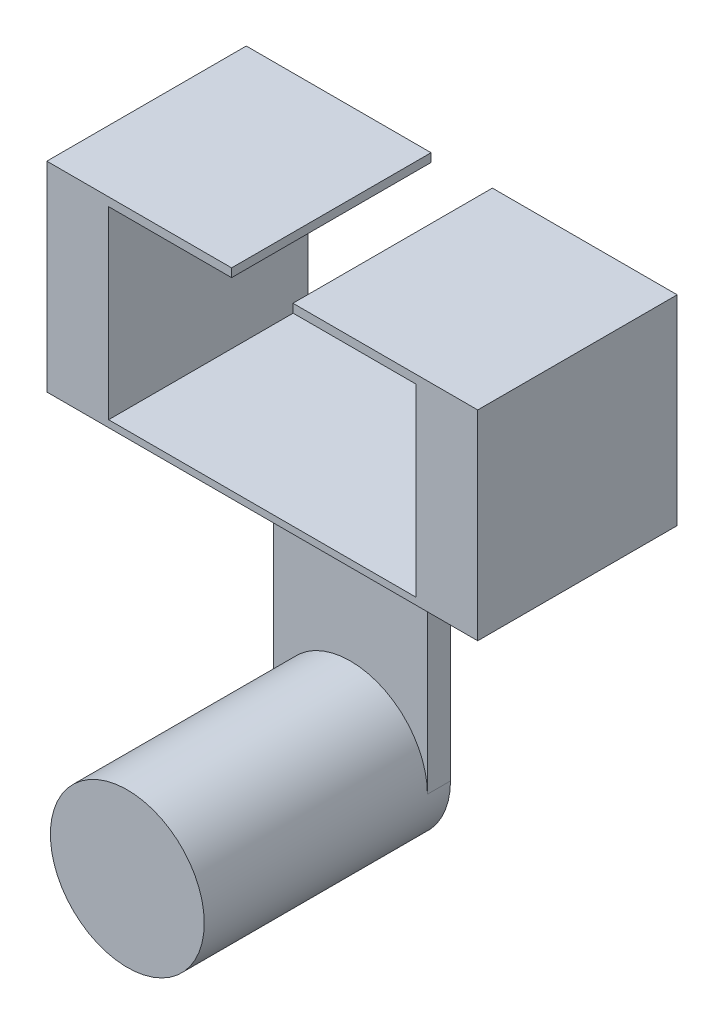
ISO-10303-21;
HEADER;
FILE_DESCRIPTION(('STEP AP214'),'2;1');
FILE_NAME('part.step','',(''),(''),'','','');
FILE_SCHEMA(('AUTOMOTIVE_DESIGN { 1 0 10303 214 1 1 1 1 }'));
ENDSEC;
DATA;
#1=APPLICATION_CONTEXT('core data for automotive mechanical design processes');
#2=APPLICATION_PROTOCOL_DEFINITION('international standard','automotive_design',2000,#1);
#3=PRODUCT_CONTEXT('',#1,'mechanical');
#4=PRODUCT('Part','Part','',(#3));
#5=PRODUCT_RELATED_PRODUCT_CATEGORY('part','',(#4));
#6=PRODUCT_DEFINITION_FORMATION('','',#4);
#7=PRODUCT_DEFINITION_CONTEXT('part definition',#1,'design');
#8=PRODUCT_DEFINITION('design','',#6,#7);
#9=PRODUCT_DEFINITION_SHAPE('','',#8);
#10=(LENGTH_UNIT() NAMED_UNIT(*) SI_UNIT(.MILLI.,.METRE.));
#11=(NAMED_UNIT(*) PLANE_ANGLE_UNIT() SI_UNIT($,.RADIAN.));
#12=(NAMED_UNIT(*) SI_UNIT($,.STERADIAN.) SOLID_ANGLE_UNIT());
#13=UNCERTAINTY_MEASURE_WITH_UNIT(LENGTH_MEASURE(1.E-05),#10,'distance_accuracy_value','');
#14=(GEOMETRIC_REPRESENTATION_CONTEXT(3) GLOBAL_UNCERTAINTY_ASSIGNED_CONTEXT((#13)) GLOBAL_UNIT_ASSIGNED_CONTEXT((#10,
#11,#12)) REPRESENTATION_CONTEXT('',''));
#15=CARTESIAN_POINT('',(0.,0.,0.));
#16=DIRECTION('',(0.,0.,1.));
#17=DIRECTION('',(1.,0.,0.));
#18=AXIS2_PLACEMENT_3D('',#15,#16,#17);
#19=CARTESIAN_POINT('',(0.,92.0496,0.));
#20=DIRECTION('',(0.,-1.,0.));
#21=DIRECTION('',(0.,0.,-1.));
#22=AXIS2_PLACEMENT_3D('',#19,#20,#21);
#23=PLANE('',#22);
#24=DIRECTION('',(-1.,0.,0.));
#25=VECTOR('',#24,1.);
#26=CARTESIAN_POINT('',(-44.45,92.0496,-18.19275));
#27=LINE('',#26,#25);
#28=CARTESIAN_POINT('',(44.45,92.0496,-18.19275));
#29=VERTEX_POINT('',#28);
#30=CARTESIAN_POINT('',(6.3246,92.0496,-18.19275));
#31=VERTEX_POINT('',#30);
#32=EDGE_CURVE('E266',#29,#31,#27,.T.);
#33=ORIENTED_EDGE('',*,*,#32,.T.);
#34=DIRECTION('',(0.,0.,1.));
#35=VECTOR('',#34,1.);
#36=CARTESIAN_POINT('',(6.3246,92.0496,-18.19275));
#37=LINE('',#36,#35);
#38=CARTESIAN_POINT('',(6.3246,92.0496,22.95525));
#39=VERTEX_POINT('',#38);
#40=EDGE_CURVE('E240',#31,#39,#37,.T.);
#41=ORIENTED_EDGE('',*,*,#40,.T.);
#42=DIRECTION('',(1.,0.,0.));
#43=VECTOR('',#42,1.);
#44=CARTESIAN_POINT('',(-44.45,92.0496,22.95525));
#45=LINE('',#44,#43);
#46=CARTESIAN_POINT('',(44.45,92.0496,22.95525));
#47=VERTEX_POINT('',#46);
#48=EDGE_CURVE('E273',#39,#47,#45,.T.);
#49=ORIENTED_EDGE('',*,*,#48,.T.);
#50=DIRECTION('',(0.,0.,-1.));
#51=VECTOR('',#50,1.);
#52=CARTESIAN_POINT('',(44.45,92.0496,22.95525));
#53=LINE('',#52,#51);
#54=EDGE_CURVE('E261',#47,#29,#53,.T.);
#55=ORIENTED_EDGE('',*,*,#54,.T.);
#56=EDGE_LOOP('',(#33,#41,#49,#55));
#57=FACE_BOUND('',#56,.T.);
#58=ADVANCED_FACE('F58',(#57),#23,.F.);
#59=CARTESIAN_POINT('',(0.,0.,50.8));
#60=DIRECTION('',(0.,0.,-1.));
#61=DIRECTION('',(-1.,0.,0.));
#62=AXIS2_PLACEMENT_3D('',#59,#60,#61);
#63=CYLINDRICAL_SURFACE('',#62,15.875);
#64=CARTESIAN_POINT('',(0.,0.,50.8));
#65=DIRECTION('',(0.,0.,1.));
#66=DIRECTION('',(1.,0.,0.));
#67=AXIS2_PLACEMENT_3D('',#64,#65,#66);
#68=CIRCLE('',#67,15.875);
#69=CARTESIAN_POINT('',(15.875,0.,50.8));
#70=VERTEX_POINT('',#69);
#71=EDGE_CURVE('E67',#70,#70,#68,.T.);
#72=ORIENTED_EDGE('',*,*,#71,.F.);
#73=EDGE_LOOP('',(#72));
#74=FACE_BOUND('',#73,.T.);
#75=CARTESIAN_POINT('',(0.,0.,4.7625));
#76=DIRECTION('',(0.,0.,1.));
#77=DIRECTION('',(1.,0.,0.));
#78=AXIS2_PLACEMENT_3D('',#75,#76,#77);
#79=CIRCLE('',#78,15.875);
#80=CARTESIAN_POINT('',(15.875,0.,4.7625));
#81=VERTEX_POINT('',#80);
#82=CARTESIAN_POINT('',(-15.875,0.,4.7625));
#83=VERTEX_POINT('',#82);
#84=EDGE_CURVE('E13',#81,#83,#79,.T.);
#85=ORIENTED_EDGE('',*,*,#84,.T.);
#86=DIRECTION('',(0.,0.,-1.));
#87=VECTOR('',#86,1.);
#88=CARTESIAN_POINT('',(-15.875,0.,4.7625));
#89=LINE('',#88,#87);
#90=CARTESIAN_POINT('',(-15.875,0.,0.));
#91=VERTEX_POINT('',#90);
#92=EDGE_CURVE('E336',#83,#91,#89,.T.);
#93=ORIENTED_EDGE('',*,*,#92,.T.);
#94=CARTESIAN_POINT('',(0.,0.,0.));
#95=DIRECTION('',(0.,0.,1.));
#96=DIRECTION('',(1.,0.,0.));
#97=AXIS2_PLACEMENT_3D('',#94,#95,#96);
#98=CIRCLE('',#97,15.875);
#99=CARTESIAN_POINT('',(15.875,0.,0.));
#100=VERTEX_POINT('',#99);
#101=EDGE_CURVE('E332',#91,#100,#98,.T.);
#102=ORIENTED_EDGE('',*,*,#101,.T.);
#103=DIRECTION('',(0.,0.,-1.));
#104=VECTOR('',#103,1.);
#105=CARTESIAN_POINT('',(15.875,0.,4.7625));
#106=LINE('',#105,#104);
#107=EDGE_CURVE('E318',#81,#100,#106,.T.);
#108=ORIENTED_EDGE('',*,*,#107,.F.);
#109=EDGE_LOOP('',(#85,#93,#102,#108));
#110=FACE_BOUND('',#109,.T.);
#111=ADVANCED_FACE('F60',(#74,#110),#63,.T.);
#112=CARTESIAN_POINT('',(0.,0.,50.8));
#113=DIRECTION('',(0.,0.,1.));
#114=DIRECTION('',(1.,0.,0.));
#115=AXIS2_PLACEMENT_3D('',#112,#113,#114);
#116=PLANE('',#115);
#117=ORIENTED_EDGE('',*,*,#71,.T.);
#118=EDGE_LOOP('',(#117));
#119=FACE_BOUND('',#118,.T.);
#120=ADVANCED_FACE('F380',(#119),#116,.T.);
#121=CARTESIAN_POINT('',(0.,0.,0.));
#122=DIRECTION('',(0.,0.,1.));
#123=DIRECTION('',(1.,0.,0.));
#124=AXIS2_PLACEMENT_3D('',#121,#122,#123);
#125=PLANE('',#124);
#126=ORIENTED_EDGE('',*,*,#101,.F.);
#127=DIRECTION('',(0.,1.,0.));
#128=VECTOR('',#127,1.);
#129=CARTESIAN_POINT('',(-15.875,0.,0.));
#130=LINE('',#129,#128);
#131=CARTESIAN_POINT('',(-15.875,50.8,0.));
#132=VERTEX_POINT('',#131);
#133=EDGE_CURVE('E322',#91,#132,#130,.T.);
#134=ORIENTED_EDGE('',*,*,#133,.T.);
#135=DIRECTION('',(1.,0.,0.));
#136=VECTOR('',#135,1.);
#137=CARTESIAN_POINT('',(15.875,50.8,0.));
#138=LINE('',#137,#136);
#139=CARTESIAN_POINT('',(15.875,50.8,0.));
#140=VERTEX_POINT('',#139);
#141=EDGE_CURVE('E311',#132,#140,#138,.T.);
#142=ORIENTED_EDGE('',*,*,#141,.T.);
#143=DIRECTION('',(0.,-1.,0.));
#144=VECTOR('',#143,1.);
#145=CARTESIAN_POINT('',(15.875,0.,0.));
#146=LINE('',#145,#144);
#147=EDGE_CURVE('E305',#140,#100,#146,.T.);
#148=ORIENTED_EDGE('',*,*,#147,.T.);
#149=EDGE_LOOP('',(#126,#134,#142,#148));
#150=FACE_BOUND('',#149,.T.);
#151=ADVANCED_FACE('F352',(#150),#125,.F.);
#152=CARTESIAN_POINT('',(15.875,0.,4.7625));
#153=DIRECTION('',(1.,0.,0.));
#154=DIRECTION('',(0.,0.,-1.));
#155=AXIS2_PLACEMENT_3D('',#152,#153,#154);
#156=PLANE('',#155);
#157=ORIENTED_EDGE('',*,*,#147,.F.);
#158=DIRECTION('',(0.,0.,-1.));
#159=VECTOR('',#158,1.);
#160=CARTESIAN_POINT('',(15.875,50.8,4.7625));
#161=LINE('',#160,#159);
#162=CARTESIAN_POINT('',(15.875,50.8,4.7625));
#163=VERTEX_POINT('',#162);
#164=EDGE_CURVE('E328',#163,#140,#161,.T.);
#165=ORIENTED_EDGE('',*,*,#164,.F.);
#166=DIRECTION('',(0.,-1.,0.));
#167=VECTOR('',#166,1.);
#168=CARTESIAN_POINT('',(15.875,0.,4.7625));
#169=LINE('',#168,#167);
#170=EDGE_CURVE('E306',#163,#81,#169,.T.);
#171=ORIENTED_EDGE('',*,*,#170,.T.);
#172=ORIENTED_EDGE('',*,*,#107,.T.);
#173=EDGE_LOOP('',(#157,#165,#171,#172));
#174=FACE_BOUND('',#173,.T.);
#175=ADVANCED_FACE('F350',(#174),#156,.T.);
#176=CARTESIAN_POINT('',(-15.875,0.,4.7625));
#177=DIRECTION('',(-1.,0.,0.));
#178=DIRECTION('',(0.,0.,1.));
#179=AXIS2_PLACEMENT_3D('',#176,#177,#178);
#180=PLANE('',#179);
#181=ORIENTED_EDGE('',*,*,#133,.F.);
#182=ORIENTED_EDGE('',*,*,#92,.F.);
#183=DIRECTION('',(0.,1.,0.));
#184=VECTOR('',#183,1.);
#185=CARTESIAN_POINT('',(-15.875,0.,4.7625));
#186=LINE('',#185,#184);
#187=CARTESIAN_POINT('',(-15.875,50.8,4.7625));
#188=VERTEX_POINT('',#187);
#189=EDGE_CURVE('E310',#83,#188,#186,.T.);
#190=ORIENTED_EDGE('',*,*,#189,.T.);
#191=DIRECTION('',(0.,0.,-1.));
#192=VECTOR('',#191,1.);
#193=CARTESIAN_POINT('',(-15.875,50.8,4.7625));
#194=LINE('',#193,#192);
#195=EDGE_CURVE('E333',#188,#132,#194,.T.);
#196=ORIENTED_EDGE('',*,*,#195,.T.);
#197=EDGE_LOOP('',(#181,#182,#190,#196));
#198=FACE_BOUND('',#197,.T.);
#199=ADVANCED_FACE('F362',(#198),#180,.T.);
#200=CARTESIAN_POINT('',(0.,0.,4.7625));
#201=DIRECTION('',(0.,0.,1.));
#202=DIRECTION('',(1.,0.,0.));
#203=AXIS2_PLACEMENT_3D('',#200,#201,#202);
#204=PLANE('',#203);
#205=ORIENTED_EDGE('',*,*,#84,.F.);
#206=ORIENTED_EDGE('',*,*,#170,.F.);
#207=DIRECTION('',(1.,0.,0.));
#208=VECTOR('',#207,1.);
#209=CARTESIAN_POINT('',(15.875,50.8,4.7625));
#210=LINE('',#209,#208);
#211=EDGE_CURVE('E314',#188,#163,#210,.T.);
#212=ORIENTED_EDGE('',*,*,#211,.F.);
#213=ORIENTED_EDGE('',*,*,#189,.F.);
#214=EDGE_LOOP('',(#205,#206,#212,#213));
#215=FACE_BOUND('',#214,.T.);
#216=ADVANCED_FACE('F359',(#215),#204,.T.);
#217=CARTESIAN_POINT('',(0.,50.8,0.));
#218=DIRECTION('',(0.,-1.,0.));
#219=DIRECTION('',(0.,0.,-1.));
#220=AXIS2_PLACEMENT_3D('',#217,#218,#219);
#221=PLANE('',#220);
#222=DIRECTION('',(0.,0.,-1.));
#223=VECTOR('',#222,1.);
#224=CARTESIAN_POINT('',(44.45,50.8,22.95525));
#225=LINE('',#224,#223);
#226=CARTESIAN_POINT('',(44.45,50.8,22.95525));
#227=VERTEX_POINT('',#226);
#228=CARTESIAN_POINT('',(44.45,50.8,-18.19275));
#229=VERTEX_POINT('',#228);
#230=EDGE_CURVE('E244',#227,#229,#225,.T.);
#231=ORIENTED_EDGE('',*,*,#230,.F.);
#232=DIRECTION('',(1.,0.,0.));
#233=VECTOR('',#232,1.);
#234=CARTESIAN_POINT('',(-44.45,50.8,22.95525));
#235=LINE('',#234,#233);
#236=CARTESIAN_POINT('',(-44.45,50.8,22.95525));
#237=VERTEX_POINT('',#236);
#238=EDGE_CURVE('E265',#237,#227,#235,.T.);
#239=ORIENTED_EDGE('',*,*,#238,.F.);
#240=DIRECTION('',(0.,0.,1.));
#241=VECTOR('',#240,1.);
#242=CARTESIAN_POINT('',(-44.45,50.8,22.95525));
#243=LINE('',#242,#241);
#244=CARTESIAN_POINT('',(-44.45,50.8,-18.19275));
#245=VERTEX_POINT('',#244);
#246=EDGE_CURVE('E285',#245,#237,#243,.T.);
#247=ORIENTED_EDGE('',*,*,#246,.F.);
#248=DIRECTION('',(-1.,0.,0.));
#249=VECTOR('',#248,1.);
#250=CARTESIAN_POINT('',(-44.45,50.8,-18.19275));
#251=LINE('',#250,#249);
#252=EDGE_CURVE('E282',#229,#245,#251,.T.);
#253=ORIENTED_EDGE('',*,*,#252,.F.);
#254=EDGE_LOOP('',(#231,#239,#247,#253));
#255=FACE_BOUND('',#254,.T.);
#256=ORIENTED_EDGE('',*,*,#141,.F.);
#257=ORIENTED_EDGE('',*,*,#195,.F.);
#258=ORIENTED_EDGE('',*,*,#211,.T.);
#259=ORIENTED_EDGE('',*,*,#164,.T.);
#260=EDGE_LOOP('',(#256,#257,#258,#259));
#261=FACE_BOUND('',#260,.T.);
#262=ADVANCED_FACE('F356',(#255,#261),#221,.T.);
#263=CARTESIAN_POINT('',(44.45,92.0496,22.95525));
#264=DIRECTION('',(-1.,0.,0.));
#265=DIRECTION('',(0.,0.,1.));
#266=AXIS2_PLACEMENT_3D('',#263,#264,#265);
#267=PLANE('',#266);
#268=ORIENTED_EDGE('',*,*,#230,.T.);
#269=DIRECTION('',(0.,-1.,0.));
#270=VECTOR('',#269,1.);
#271=CARTESIAN_POINT('',(44.45,92.0496,-18.19275));
#272=LINE('',#271,#270);
#273=EDGE_CURVE('E301',#29,#229,#272,.T.);
#274=ORIENTED_EDGE('',*,*,#273,.F.);
#275=ORIENTED_EDGE('',*,*,#54,.F.);
#276=DIRECTION('',(0.,-1.,0.));
#277=VECTOR('',#276,1.);
#278=CARTESIAN_POINT('',(44.45,92.0496,22.95525));
#279=LINE('',#278,#277);
#280=EDGE_CURVE('E278',#47,#227,#279,.T.);
#281=ORIENTED_EDGE('',*,*,#280,.T.);
#282=EDGE_LOOP('',(#268,#274,#275,#281));
#283=FACE_BOUND('',#282,.T.);
#284=ADVANCED_FACE('F422',(#283),#267,.F.);
#285=CARTESIAN_POINT('',(-44.45,92.0496,-18.19275));
#286=DIRECTION('',(0.,0.,1.));
#287=DIRECTION('',(1.,0.,0.));
#288=AXIS2_PLACEMENT_3D('',#285,#286,#287);
#289=PLANE('',#288);
#290=DIRECTION('',(-1.,0.,0.));
#291=VECTOR('',#290,1.);
#292=CARTESIAN_POINT('',(31.70428,90.297,-18.19275));
#293=LINE('',#292,#291);
#294=CARTESIAN_POINT('',(31.70428,90.297,-18.19275));
#295=VERTEX_POINT('',#294);
#296=CARTESIAN_POINT('',(6.3246,90.297,-18.19275));
#297=VERTEX_POINT('',#296);
#298=EDGE_CURVE('E213',#295,#297,#293,.T.);
#299=ORIENTED_EDGE('',*,*,#298,.T.);
#300=DIRECTION('',(0.,1.,0.));
#301=VECTOR('',#300,1.);
#302=CARTESIAN_POINT('',(6.3246,90.297,-18.19275));
#303=LINE('',#302,#301);
#304=EDGE_CURVE('E216',#297,#31,#303,.T.);
#305=ORIENTED_EDGE('',*,*,#304,.T.);
#306=ORIENTED_EDGE('',*,*,#32,.F.);
#307=ORIENTED_EDGE('',*,*,#273,.T.);
#308=ORIENTED_EDGE('',*,*,#252,.T.);
#309=DIRECTION('',(0.,-1.,0.));
#310=VECTOR('',#309,1.);
#311=CARTESIAN_POINT('',(-44.45,92.0496,-18.19275));
#312=LINE('',#311,#310);
#313=CARTESIAN_POINT('',(-44.45,92.0496,-18.19275));
#314=VERTEX_POINT('',#313);
#315=EDGE_CURVE('E297',#314,#245,#312,.T.);
#316=ORIENTED_EDGE('',*,*,#315,.F.);
#317=CARTESIAN_POINT('',(-6.3246,92.0496,-18.19275));
#318=VERTEX_POINT('',#317);
#319=EDGE_CURVE('E194',#318,#314,#27,.T.);
#320=ORIENTED_EDGE('',*,*,#319,.F.);
#321=DIRECTION('',(0.,-1.,0.));
#322=VECTOR('',#321,1.);
#323=CARTESIAN_POINT('',(-6.3246,92.0496,-18.19275));
#324=LINE('',#323,#322);
#325=CARTESIAN_POINT('',(-6.3246,90.297,-18.19275));
#326=VERTEX_POINT('',#325);
#327=EDGE_CURVE('E74',#318,#326,#324,.T.);
#328=ORIENTED_EDGE('',*,*,#327,.T.);
#329=DIRECTION('',(-1.,0.,0.));
#330=VECTOR('',#329,1.);
#331=CARTESIAN_POINT('',(-6.3246,90.297,-18.19275));
#332=LINE('',#331,#330);
#333=CARTESIAN_POINT('',(-31.70428,90.297,-18.19275));
#334=VERTEX_POINT('',#333);
#335=EDGE_CURVE('E182',#326,#334,#332,.T.);
#336=ORIENTED_EDGE('',*,*,#335,.T.);
#337=DIRECTION('',(0.,-1.,0.));
#338=VECTOR('',#337,1.);
#339=CARTESIAN_POINT('',(-31.70428,90.297,-18.19275));
#340=LINE('',#339,#338);
#341=CARTESIAN_POINT('',(-31.70428,52.2224,-18.19275));
#342=VERTEX_POINT('',#341);
#343=EDGE_CURVE('E188',#334,#342,#340,.T.);
#344=ORIENTED_EDGE('',*,*,#343,.T.);
#345=DIRECTION('',(1.,0.,0.));
#346=VECTOR('',#345,1.);
#347=CARTESIAN_POINT('',(-31.70428,52.2224,-18.19275));
#348=LINE('',#347,#346);
#349=CARTESIAN_POINT('',(31.70428,52.2224,-18.19275));
#350=VERTEX_POINT('',#349);
#351=EDGE_CURVE('E205',#342,#350,#348,.T.);
#352=ORIENTED_EDGE('',*,*,#351,.T.);
#353=DIRECTION('',(0.,1.,0.));
#354=VECTOR('',#353,1.);
#355=CARTESIAN_POINT('',(31.70428,52.2224,-18.19275));
#356=LINE('',#355,#354);
#357=EDGE_CURVE('E209',#350,#295,#356,.T.);
#358=ORIENTED_EDGE('',*,*,#357,.T.);
#359=EDGE_LOOP('',(#299,#305,#306,#307,#308,#316,#320,#328,#336,#344,#352,#358));
#360=FACE_BOUND('',#359,.T.);
#361=ADVANCED_FACE('F192',(#360),#289,.F.);
#362=CARTESIAN_POINT('',(-44.45,92.0496,22.95525));
#363=DIRECTION('',(1.,0.,0.));
#364=DIRECTION('',(0.,0.,-1.));
#365=AXIS2_PLACEMENT_3D('',#362,#363,#364);
#366=PLANE('',#365);
#367=ORIENTED_EDGE('',*,*,#246,.T.);
#368=DIRECTION('',(0.,-1.,0.));
#369=VECTOR('',#368,1.);
#370=CARTESIAN_POINT('',(-44.45,92.0496,22.95525));
#371=LINE('',#370,#369);
#372=CARTESIAN_POINT('',(-44.45,92.0496,22.95525));
#373=VERTEX_POINT('',#372);
#374=EDGE_CURVE('E293',#373,#237,#371,.T.);
#375=ORIENTED_EDGE('',*,*,#374,.F.);
#376=DIRECTION('',(0.,0.,1.));
#377=VECTOR('',#376,1.);
#378=CARTESIAN_POINT('',(-44.45,92.0496,22.95525));
#379=LINE('',#378,#377);
#380=EDGE_CURVE('E270',#314,#373,#379,.T.);
#381=ORIENTED_EDGE('',*,*,#380,.F.);
#382=ORIENTED_EDGE('',*,*,#315,.T.);
#383=EDGE_LOOP('',(#367,#375,#381,#382));
#384=FACE_BOUND('',#383,.T.);
#385=ADVANCED_FACE('F395',(#384),#366,.F.);
#386=CARTESIAN_POINT('',(-44.45,92.0496,22.95525));
#387=DIRECTION('',(0.,0.,-1.));
#388=DIRECTION('',(-1.,0.,0.));
#389=AXIS2_PLACEMENT_3D('',#386,#387,#388);
#390=PLANE('',#389);
#391=ORIENTED_EDGE('',*,*,#48,.F.);
#392=DIRECTION('',(0.,1.,0.));
#393=VECTOR('',#392,1.);
#394=CARTESIAN_POINT('',(6.3246,90.297,22.95525));
#395=LINE('',#394,#393);
#396=CARTESIAN_POINT('',(6.3246,90.297,22.95525));
#397=VERTEX_POINT('',#396);
#398=EDGE_CURVE('E196',#397,#39,#395,.T.);
#399=ORIENTED_EDGE('',*,*,#398,.F.);
#400=DIRECTION('',(-1.,0.,0.));
#401=VECTOR('',#400,1.);
#402=CARTESIAN_POINT('',(31.70428,90.297,22.95525));
#403=LINE('',#402,#401);
#404=CARTESIAN_POINT('',(31.70428,90.297,22.95525));
#405=VERTEX_POINT('',#404);
#406=EDGE_CURVE('E200',#405,#397,#403,.T.);
#407=ORIENTED_EDGE('',*,*,#406,.F.);
#408=DIRECTION('',(0.,1.,0.));
#409=VECTOR('',#408,1.);
#410=CARTESIAN_POINT('',(31.70428,52.2224,22.95525));
#411=LINE('',#410,#409);
#412=CARTESIAN_POINT('',(31.70428,52.2224,22.95525));
#413=VERTEX_POINT('',#412);
#414=EDGE_CURVE('E233',#413,#405,#411,.T.);
#415=ORIENTED_EDGE('',*,*,#414,.F.);
#416=DIRECTION('',(1.,0.,0.));
#417=VECTOR('',#416,1.);
#418=CARTESIAN_POINT('',(-31.70428,52.2224,22.95525));
#419=LINE('',#418,#417);
#420=CARTESIAN_POINT('',(-31.70428,52.2224,22.95525));
#421=VERTEX_POINT('',#420);
#422=EDGE_CURVE('E229',#421,#413,#419,.T.);
#423=ORIENTED_EDGE('',*,*,#422,.F.);
#424=DIRECTION('',(0.,-1.,0.));
#425=VECTOR('',#424,1.);
#426=CARTESIAN_POINT('',(-31.70428,90.297,22.95525));
#427=LINE('',#426,#425);
#428=CARTESIAN_POINT('',(-31.70428,90.297,22.95525));
#429=VERTEX_POINT('',#428);
#430=EDGE_CURVE('E225',#429,#421,#427,.T.);
#431=ORIENTED_EDGE('',*,*,#430,.F.);
#432=DIRECTION('',(-1.,0.,0.));
#433=VECTOR('',#432,1.);
#434=CARTESIAN_POINT('',(-6.3246,90.297,22.95525));
#435=LINE('',#434,#433);
#436=CARTESIAN_POINT('',(-6.3246,90.297,22.95525));
#437=VERTEX_POINT('',#436);
#438=EDGE_CURVE('E222',#437,#429,#435,.T.);
#439=ORIENTED_EDGE('',*,*,#438,.F.);
#440=DIRECTION('',(0.,-1.,0.));
#441=VECTOR('',#440,1.);
#442=CARTESIAN_POINT('',(-6.3246,92.0496,22.95525));
#443=LINE('',#442,#441);
#444=CARTESIAN_POINT('',(-6.3246,92.0496,22.95525));
#445=VERTEX_POINT('',#444);
#446=EDGE_CURVE('E173',#445,#437,#443,.T.);
#447=ORIENTED_EDGE('',*,*,#446,.F.);
#448=EDGE_CURVE('E274',#373,#445,#45,.T.);
#449=ORIENTED_EDGE('',*,*,#448,.F.);
#450=ORIENTED_EDGE('',*,*,#374,.T.);
#451=ORIENTED_EDGE('',*,*,#238,.T.);
#452=ORIENTED_EDGE('',*,*,#280,.F.);
#453=EDGE_LOOP('',(#391,#399,#407,#415,#423,#431,#439,#447,#449,#450,#451,#452));
#454=FACE_BOUND('',#453,.T.);
#455=ADVANCED_FACE('F386',(#454),#390,.F.);
#456=ORIENTED_EDGE('',*,*,#448,.T.);
#457=DIRECTION('',(0.,0.,1.));
#458=VECTOR('',#457,1.);
#459=CARTESIAN_POINT('',(-6.3246,92.0496,-18.19275));
#460=LINE('',#459,#458);
#461=EDGE_CURVE('E179',#318,#445,#460,.T.);
#462=ORIENTED_EDGE('',*,*,#461,.F.);
#463=ORIENTED_EDGE('',*,*,#319,.T.);
#464=ORIENTED_EDGE('',*,*,#380,.T.);
#465=EDGE_LOOP('',(#456,#462,#463,#464));
#466=FACE_BOUND('',#465,.T.);
#467=ADVANCED_FACE('F374',(#466),#23,.F.);
#468=CARTESIAN_POINT('',(6.3246,90.297,-18.19275));
#469=DIRECTION('',(1.,0.,0.));
#470=DIRECTION('',(0.,1.,0.));
#471=AXIS2_PLACEMENT_3D('',#468,#469,#470);
#472=PLANE('',#471);
#473=ORIENTED_EDGE('',*,*,#398,.T.);
#474=ORIENTED_EDGE('',*,*,#40,.F.);
#475=ORIENTED_EDGE('',*,*,#304,.F.);
#476=DIRECTION('',(0.,0.,1.));
#477=VECTOR('',#476,1.);
#478=CARTESIAN_POINT('',(6.3246,90.297,-18.19275));
#479=LINE('',#478,#477);
#480=EDGE_CURVE('E245',#297,#397,#479,.T.);
#481=ORIENTED_EDGE('',*,*,#480,.T.);
#482=EDGE_LOOP('',(#473,#474,#475,#481));
#483=FACE_BOUND('',#482,.T.);
#484=ADVANCED_FACE('F385',(#483),#472,.F.);
#485=CARTESIAN_POINT('',(31.70428,90.297,-18.19275));
#486=DIRECTION('',(0.,1.,0.));
#487=DIRECTION('',(-1.,0.,0.));
#488=AXIS2_PLACEMENT_3D('',#485,#486,#487);
#489=PLANE('',#488);
#490=ORIENTED_EDGE('',*,*,#406,.T.);
#491=ORIENTED_EDGE('',*,*,#480,.F.);
#492=ORIENTED_EDGE('',*,*,#298,.F.);
#493=DIRECTION('',(0.,0.,1.));
#494=VECTOR('',#493,1.);
#495=CARTESIAN_POINT('',(31.70428,90.297,-18.19275));
#496=LINE('',#495,#494);
#497=EDGE_CURVE('E248',#295,#405,#496,.T.);
#498=ORIENTED_EDGE('',*,*,#497,.T.);
#499=EDGE_LOOP('',(#490,#491,#492,#498));
#500=FACE_BOUND('',#499,.T.);
#501=ADVANCED_FACE('F392',(#500),#489,.F.);
#502=CARTESIAN_POINT('',(31.70428,52.2224,-18.19275));
#503=DIRECTION('',(1.,0.,0.));
#504=DIRECTION('',(0.,0.,-1.));
#505=AXIS2_PLACEMENT_3D('',#502,#503,#504);
#506=PLANE('',#505);
#507=ORIENTED_EDGE('',*,*,#414,.T.);
#508=ORIENTED_EDGE('',*,*,#497,.F.);
#509=ORIENTED_EDGE('',*,*,#357,.F.);
#510=DIRECTION('',(0.,0.,1.));
#511=VECTOR('',#510,1.);
#512=CARTESIAN_POINT('',(31.70428,52.2224,-18.19275));
#513=LINE('',#512,#511);
#514=EDGE_CURVE('E251',#350,#413,#513,.T.);
#515=ORIENTED_EDGE('',*,*,#514,.T.);
#516=EDGE_LOOP('',(#507,#508,#509,#515));
#517=FACE_BOUND('',#516,.T.);
#518=ADVANCED_FACE('F413',(#517),#506,.F.);
#519=CARTESIAN_POINT('',(-31.70428,52.2224,-18.19275));
#520=DIRECTION('',(0.,-1.,0.));
#521=DIRECTION('',(1.,0.,0.));
#522=AXIS2_PLACEMENT_3D('',#519,#520,#521);
#523=PLANE('',#522);
#524=ORIENTED_EDGE('',*,*,#422,.T.);
#525=ORIENTED_EDGE('',*,*,#514,.F.);
#526=ORIENTED_EDGE('',*,*,#351,.F.);
#527=DIRECTION('',(0.,0.,1.));
#528=VECTOR('',#527,1.);
#529=CARTESIAN_POINT('',(-31.70428,52.2224,-18.19275));
#530=LINE('',#529,#528);
#531=EDGE_CURVE('E254',#342,#421,#530,.T.);
#532=ORIENTED_EDGE('',*,*,#531,.T.);
#533=EDGE_LOOP('',(#524,#525,#526,#532));
#534=FACE_BOUND('',#533,.T.);
#535=ADVANCED_FACE('F411',(#534),#523,.F.);
#536=CARTESIAN_POINT('',(-31.70428,90.297,-18.19275));
#537=DIRECTION('',(-1.,0.,0.));
#538=DIRECTION('',(0.,-1.,0.));
#539=AXIS2_PLACEMENT_3D('',#536,#537,#538);
#540=PLANE('',#539);
#541=ORIENTED_EDGE('',*,*,#430,.T.);
#542=ORIENTED_EDGE('',*,*,#531,.F.);
#543=ORIENTED_EDGE('',*,*,#343,.F.);
#544=DIRECTION('',(0.,0.,1.));
#545=VECTOR('',#544,1.);
#546=CARTESIAN_POINT('',(-31.70428,90.297,-18.19275));
#547=LINE('',#546,#545);
#548=EDGE_CURVE('E178',#334,#429,#547,.T.);
#549=ORIENTED_EDGE('',*,*,#548,.T.);
#550=EDGE_LOOP('',(#541,#542,#543,#549));
#551=FACE_BOUND('',#550,.T.);
#552=ADVANCED_FACE('F407',(#551),#540,.F.);
#553=CARTESIAN_POINT('',(-6.3246,90.297,-18.19275));
#554=DIRECTION('',(0.,1.,0.));
#555=DIRECTION('',(0.,0.,1.));
#556=AXIS2_PLACEMENT_3D('',#553,#554,#555);
#557=PLANE('',#556);
#558=ORIENTED_EDGE('',*,*,#438,.T.);
#559=ORIENTED_EDGE('',*,*,#548,.F.);
#560=ORIENTED_EDGE('',*,*,#335,.F.);
#561=DIRECTION('',(0.,0.,1.));
#562=VECTOR('',#561,1.);
#563=CARTESIAN_POINT('',(-6.3246,90.297,-18.19275));
#564=LINE('',#563,#562);
#565=EDGE_CURVE('E169',#326,#437,#564,.T.);
#566=ORIENTED_EDGE('',*,*,#565,.T.);
#567=EDGE_LOOP('',(#558,#559,#560,#566));
#568=FACE_BOUND('',#567,.T.);
#569=ADVANCED_FACE('F183',(#568),#557,.F.);
#570=CARTESIAN_POINT('',(-6.3246,92.0496,-18.19275));
#571=DIRECTION('',(-1.,0.,0.));
#572=DIRECTION('',(0.,0.,1.));
#573=AXIS2_PLACEMENT_3D('',#570,#571,#572);
#574=PLANE('',#573);
#575=ORIENTED_EDGE('',*,*,#446,.T.);
#576=ORIENTED_EDGE('',*,*,#565,.F.);
#577=ORIENTED_EDGE('',*,*,#327,.F.);
#578=ORIENTED_EDGE('',*,*,#461,.T.);
#579=EDGE_LOOP('',(#575,#576,#577,#578));
#580=FACE_BOUND('',#579,.T.);
#581=ADVANCED_FACE('F171',(#580),#574,.F.);
#582=CLOSED_SHELL('',(#58,#111,#120,#151,#175,#199,#216,#262,#284,#361,#385,#455,#467,#484,#501,
#518,#535,#552,#569,#581));
#583=MANIFOLD_SOLID_BREP('B2',#582);
#584=ADVANCED_BREP_SHAPE_REPRESENTATION('',(#18,#583),#14);
#585=SHAPE_DEFINITION_REPRESENTATION(#9,#584);
ENDSEC;
END-ISO-10303-21;
